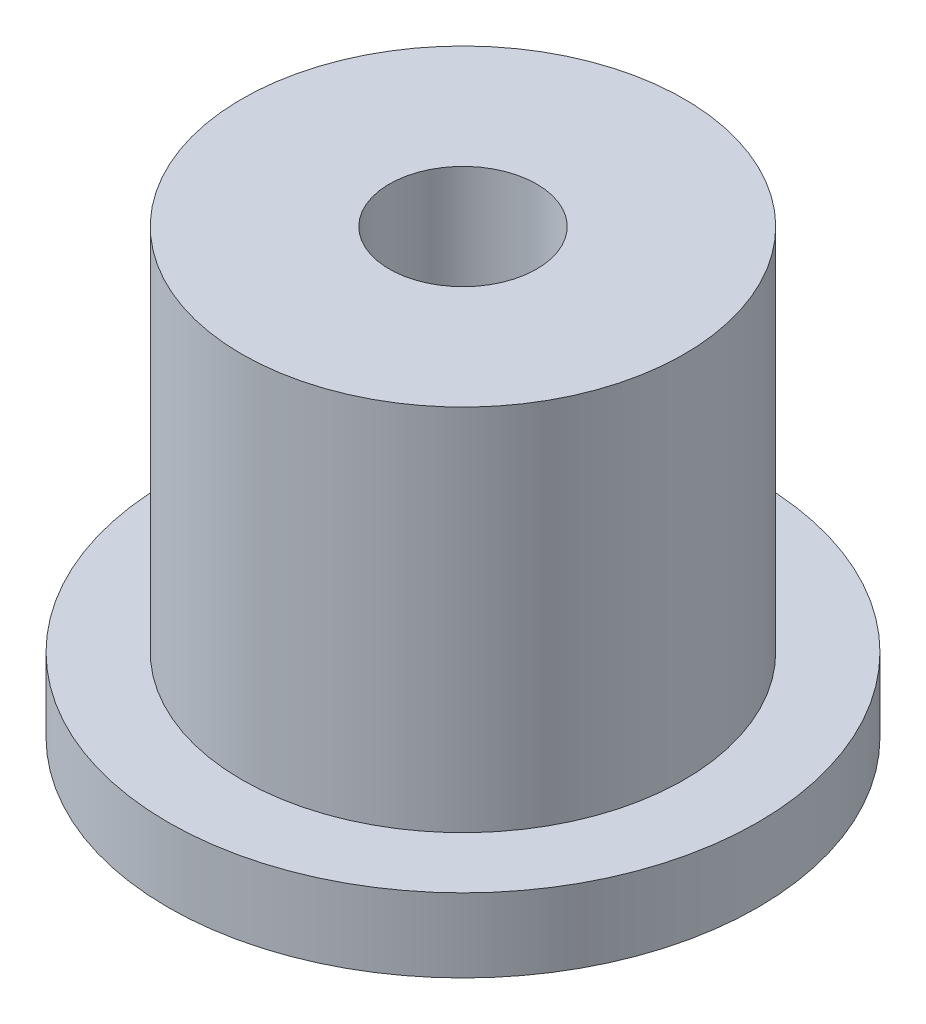
ISO-10303-21;
HEADER;
FILE_DESCRIPTION(('STEP AP214'),'2;1');
FILE_NAME('part.step','',(''),(''),'','','');
FILE_SCHEMA(('AUTOMOTIVE_DESIGN { 1 0 10303 214 1 1 1 1 }'));
ENDSEC;
DATA;
#1=APPLICATION_CONTEXT('core data for automotive mechanical design processes');
#2=APPLICATION_PROTOCOL_DEFINITION('international standard','automotive_design',2000,#1);
#3=PRODUCT_CONTEXT('',#1,'mechanical');
#4=PRODUCT('Part','Part','',(#3));
#5=PRODUCT_RELATED_PRODUCT_CATEGORY('part','',(#4));
#6=PRODUCT_DEFINITION_FORMATION('','',#4);
#7=PRODUCT_DEFINITION_CONTEXT('part definition',#1,'design');
#8=PRODUCT_DEFINITION('design','',#6,#7);
#9=PRODUCT_DEFINITION_SHAPE('','',#8);
#10=(LENGTH_UNIT() NAMED_UNIT(*) SI_UNIT(.MILLI.,.METRE.));
#11=(NAMED_UNIT(*) PLANE_ANGLE_UNIT() SI_UNIT($,.RADIAN.));
#12=(NAMED_UNIT(*) SI_UNIT($,.STERADIAN.) SOLID_ANGLE_UNIT());
#13=UNCERTAINTY_MEASURE_WITH_UNIT(LENGTH_MEASURE(1.E-05),#10,'distance_accuracy_value','');
#14=(GEOMETRIC_REPRESENTATION_CONTEXT(3) GLOBAL_UNCERTAINTY_ASSIGNED_CONTEXT((#13)) GLOBAL_UNIT_ASSIGNED_CONTEXT((#10,
#11,#12)) REPRESENTATION_CONTEXT('',''));
#15=CARTESIAN_POINT('',(0.,0.,0.));
#16=DIRECTION('',(0.,0.,1.));
#17=DIRECTION('',(1.,0.,0.));
#18=AXIS2_PLACEMENT_3D('',#15,#16,#17);
#19=CARTESIAN_POINT('',(0.,6.35,0.));
#20=DIRECTION('',(0.,-1.,0.));
#21=DIRECTION('',(0.,0.,-1.));
#22=AXIS2_PLACEMENT_3D('',#19,#20,#21);
#23=CYLINDRICAL_SURFACE('',#22,25.4);
#24=CARTESIAN_POINT('',(0.,6.35,0.));
#25=DIRECTION('',(0.,1.,0.));
#26=DIRECTION('',(0.,0.,1.));
#27=AXIS2_PLACEMENT_3D('',#24,#25,#26);
#28=CIRCLE('',#27,25.4);
#29=CARTESIAN_POINT('',(0.,6.35,25.4));
#30=VERTEX_POINT('',#29);
#31=EDGE_CURVE('E51',#30,#30,#28,.T.);
#32=ORIENTED_EDGE('',*,*,#31,.F.);
#33=EDGE_LOOP('',(#32));
#34=FACE_BOUND('',#33,.T.);
#35=CARTESIAN_POINT('',(0.,0.,0.));
#36=DIRECTION('',(0.,1.,0.));
#37=DIRECTION('',(0.,0.,1.));
#38=AXIS2_PLACEMENT_3D('',#35,#36,#37);
#39=CIRCLE('',#38,25.4);
#40=CARTESIAN_POINT('',(0.,0.,25.4));
#41=VERTEX_POINT('',#40);
#42=EDGE_CURVE('E46',#41,#41,#39,.T.);
#43=ORIENTED_EDGE('',*,*,#42,.T.);
#44=EDGE_LOOP('',(#43));
#45=FACE_BOUND('',#44,.T.);
#46=ADVANCED_FACE('F43',(#34,#45),#23,.T.);
#47=CARTESIAN_POINT('',(0.,6.35,0.));
#48=DIRECTION('',(0.,1.,0.));
#49=DIRECTION('',(0.,0.,1.));
#50=AXIS2_PLACEMENT_3D('',#47,#48,#49);
#51=PLANE('',#50);
#52=CARTESIAN_POINT('',(0.,6.35,0.));
#53=DIRECTION('',(0.,1.,0.));
#54=DIRECTION('',(0.,0.,1.));
#55=AXIS2_PLACEMENT_3D('',#52,#53,#54);
#56=CIRCLE('',#55,19.05);
#57=CARTESIAN_POINT('',(0.,6.35,19.05));
#58=VERTEX_POINT('',#57);
#59=EDGE_CURVE('E10',#58,#58,#56,.T.);
#60=ORIENTED_EDGE('',*,*,#59,.F.);
#61=EDGE_LOOP('',(#60));
#62=FACE_BOUND('',#61,.T.);
#63=ORIENTED_EDGE('',*,*,#31,.T.);
#64=EDGE_LOOP('',(#63));
#65=FACE_BOUND('',#64,.T.);
#66=ADVANCED_FACE('F86',(#62,#65),#51,.T.);
#67=CARTESIAN_POINT('',(0.,0.,0.));
#68=DIRECTION('',(0.,1.,0.));
#69=DIRECTION('',(0.,0.,1.));
#70=AXIS2_PLACEMENT_3D('',#67,#68,#69);
#71=PLANE('',#70);
#72=CARTESIAN_POINT('',(0.,0.,0.));
#73=DIRECTION('',(0.,-1.,0.));
#74=DIRECTION('',(0.,0.,-1.));
#75=AXIS2_PLACEMENT_3D('',#72,#73,#74);
#76=CIRCLE('',#75,6.35);
#77=CARTESIAN_POINT('',(0.,0.,-6.35));
#78=VERTEX_POINT('',#77);
#79=EDGE_CURVE('E64',#78,#78,#76,.T.);
#80=ORIENTED_EDGE('',*,*,#79,.F.);
#81=EDGE_LOOP('',(#80));
#82=FACE_BOUND('',#81,.T.);
#83=ORIENTED_EDGE('',*,*,#42,.F.);
#84=EDGE_LOOP('',(#83));
#85=FACE_BOUND('',#84,.T.);
#86=ADVANCED_FACE('F82',(#82,#85),#71,.F.);
#87=CARTESIAN_POINT('',(0.,38.1,0.));
#88=DIRECTION('',(0.,-1.,0.));
#89=DIRECTION('',(0.,0.,-1.));
#90=AXIS2_PLACEMENT_3D('',#87,#88,#89);
#91=CYLINDRICAL_SURFACE('',#90,19.05);
#92=CARTESIAN_POINT('',(0.,38.1,0.));
#93=DIRECTION('',(0.,1.,0.));
#94=DIRECTION('',(0.,0.,1.));
#95=AXIS2_PLACEMENT_3D('',#92,#93,#94);
#96=CIRCLE('',#95,19.05);
#97=CARTESIAN_POINT('',(0.,38.1,19.05));
#98=VERTEX_POINT('',#97);
#99=EDGE_CURVE('E59',#98,#98,#96,.T.);
#100=ORIENTED_EDGE('',*,*,#99,.F.);
#101=EDGE_LOOP('',(#100));
#102=FACE_BOUND('',#101,.T.);
#103=ORIENTED_EDGE('',*,*,#59,.T.);
#104=EDGE_LOOP('',(#103));
#105=FACE_BOUND('',#104,.T.);
#106=ADVANCED_FACE('F85',(#102,#105),#91,.T.);
#107=CARTESIAN_POINT('',(0.,38.1,0.));
#108=DIRECTION('',(0.,1.,0.));
#109=DIRECTION('',(0.,0.,1.));
#110=AXIS2_PLACEMENT_3D('',#107,#108,#109);
#111=PLANE('',#110);
#112=CARTESIAN_POINT('',(0.,38.1,0.));
#113=DIRECTION('',(0.,-1.,0.));
#114=DIRECTION('',(0.,0.,-1.));
#115=AXIS2_PLACEMENT_3D('',#112,#113,#114);
#116=CIRCLE('',#115,6.35);
#117=CARTESIAN_POINT('',(0.,38.1,-6.35));
#118=VERTEX_POINT('',#117);
#119=EDGE_CURVE('E63',#118,#118,#116,.T.);
#120=ORIENTED_EDGE('',*,*,#119,.T.);
#121=EDGE_LOOP('',(#120));
#122=FACE_BOUND('',#121,.T.);
#123=ORIENTED_EDGE('',*,*,#99,.T.);
#124=EDGE_LOOP('',(#123));
#125=FACE_BOUND('',#124,.T.);
#126=ADVANCED_FACE('F73',(#122,#125),#111,.T.);
#127=CARTESIAN_POINT('',(0.,38.1,0.));
#128=DIRECTION('',(0.,-1.,0.));
#129=DIRECTION('',(0.,0.,-1.));
#130=AXIS2_PLACEMENT_3D('',#127,#128,#129);
#131=CYLINDRICAL_SURFACE('',#130,6.35);
#132=CARTESIAN_POINT('',(0.,38.1,-6.35));
#133=CARTESIAN_POINT('',(0.,37.703125,-6.35));
#134=CARTESIAN_POINT('',(0.,37.30625,-6.35));
#135=CARTESIAN_POINT('',(0.,36.5125,-6.35));
#136=CARTESIAN_POINT('',(0.,36.115625,-6.35));
#137=CARTESIAN_POINT('',(0.,35.321875,-6.35));
#138=CARTESIAN_POINT('',(0.,34.925,-6.35));
#139=CARTESIAN_POINT('',(0.,34.13125,-6.35));
#140=CARTESIAN_POINT('',(0.,33.734375,-6.35));
#141=CARTESIAN_POINT('',(0.,32.940625,-6.35));
#142=CARTESIAN_POINT('',(0.,32.54375,-6.35));
#143=CARTESIAN_POINT('',(0.,31.75,-6.35));
#144=CARTESIAN_POINT('',(0.,31.353125,-6.35));
#145=CARTESIAN_POINT('',(0.,30.559375,-6.35));
#146=CARTESIAN_POINT('',(0.,30.1625,-6.35));
#147=CARTESIAN_POINT('',(0.,29.36875,-6.35));
#148=CARTESIAN_POINT('',(0.,28.971875,-6.35));
#149=CARTESIAN_POINT('',(0.,28.178125,-6.35));
#150=CARTESIAN_POINT('',(0.,27.78125,-6.35));
#151=CARTESIAN_POINT('',(0.,26.9875,-6.35));
#152=CARTESIAN_POINT('',(0.,26.590625,-6.35));
#153=CARTESIAN_POINT('',(0.,25.796875,-6.35));
#154=CARTESIAN_POINT('',(0.,25.4,-6.35));
#155=CARTESIAN_POINT('',(0.,24.60625,-6.35));
#156=CARTESIAN_POINT('',(0.,24.209375,-6.35));
#157=CARTESIAN_POINT('',(0.,23.415625,-6.35));
#158=CARTESIAN_POINT('',(0.,23.01875,-6.35));
#159=CARTESIAN_POINT('',(0.,22.225,-6.35));
#160=CARTESIAN_POINT('',(0.,21.828125,-6.35));
#161=CARTESIAN_POINT('',(0.,21.034375,-6.35));
#162=CARTESIAN_POINT('',(0.,20.6375,-6.35));
#163=CARTESIAN_POINT('',(0.,19.84375,-6.35));
#164=CARTESIAN_POINT('',(0.,19.446875,-6.35));
#165=CARTESIAN_POINT('',(0.,18.653125,-6.35));
#166=CARTESIAN_POINT('',(0.,18.25625,-6.35));
#167=CARTESIAN_POINT('',(0.,17.4625,-6.35));
#168=CARTESIAN_POINT('',(0.,17.065625,-6.35));
#169=CARTESIAN_POINT('',(0.,16.271875,-6.35));
#170=CARTESIAN_POINT('',(0.,15.875,-6.35));
#171=CARTESIAN_POINT('',(0.,15.08125,-6.35));
#172=CARTESIAN_POINT('',(0.,14.684375,-6.35));
#173=CARTESIAN_POINT('',(0.,13.890625,-6.35));
#174=CARTESIAN_POINT('',(0.,13.49375,-6.35));
#175=CARTESIAN_POINT('',(0.,12.7,-6.35));
#176=CARTESIAN_POINT('',(0.,12.303125,-6.35));
#177=CARTESIAN_POINT('',(0.,11.509375,-6.35));
#178=CARTESIAN_POINT('',(0.,11.1125,-6.35));
#179=CARTESIAN_POINT('',(0.,10.31875,-6.35));
#180=CARTESIAN_POINT('',(0.,9.921875,-6.35));
#181=CARTESIAN_POINT('',(0.,9.128125,-6.35));
#182=CARTESIAN_POINT('',(0.,8.73125,-6.35));
#183=CARTESIAN_POINT('',(0.,7.9375,-6.35));
#184=CARTESIAN_POINT('',(0.,7.540625,-6.35));
#185=CARTESIAN_POINT('',(0.,6.746875,-6.35));
#186=CARTESIAN_POINT('',(0.,6.35,-6.35));
#187=CARTESIAN_POINT('',(0.,5.55625,-6.35));
#188=CARTESIAN_POINT('',(0.,5.159375,-6.35));
#189=CARTESIAN_POINT('',(0.,4.365625,-6.35));
#190=CARTESIAN_POINT('',(0.,3.96875,-6.35));
#191=CARTESIAN_POINT('',(0.,3.175,-6.35));
#192=CARTESIAN_POINT('',(0.,2.778125,-6.35));
#193=CARTESIAN_POINT('',(0.,1.984375,-6.35));
#194=CARTESIAN_POINT('',(0.,1.5875,-6.35));
#195=CARTESIAN_POINT('',(0.,0.79375,-6.35));
#196=CARTESIAN_POINT('',(0.,0.396875,-6.35));
#197=CARTESIAN_POINT('',(0.,0.,-6.35));
#198=B_SPLINE_CURVE_WITH_KNOTS('',3,(#132,#133,#134,#135,#136,#137,#138,#139,#140,#141,#142,
#143,#144,#145,#146,#147,#148,#149,#150,#151,#152,#153,#154,#155,#156,#157,#158,#159,#160,#161,
#162,#163,#164,#165,#166,#167,#168,#169,#170,#171,#172,#173,#174,#175,#176,#177,#178,#179,#180,
#181,#182,#183,#184,#185,#186,#187,#188,#189,#190,#191,#192,#193,#194,#195,#196,#197),
.UNSPECIFIED.,.F.,.F.,(4,2,2,2,2,2,2,2,2,2,2,2,2,2,2,2,2,2,2,2,2,2,2,2,2,2,2,2,2,2,2,2,4),(0.,
1.190625,2.38125,3.571875,4.7625,5.953125,7.14375,8.334375,9.52500000000001,10.715625,11.90625,
13.096875,14.2875,15.478125,16.66875,17.859375,19.05,20.240625,21.43125,22.621875,23.8125,
25.003125,26.19375,27.384375,28.575,29.765625,30.95625,32.146875,33.3375,34.528125,35.71875,
36.909375,38.1),.UNSPECIFIED.);
#199=EDGE_CURVE('BSEAM76',#118,#78,#198,.T.);
#200=ORIENTED_EDGE('',*,*,#119,.F.);
#201=ORIENTED_EDGE('',*,*,#79,.T.);
#202=ORIENTED_EDGE('',*,*,#199,.T.);
#203=ORIENTED_EDGE('',*,*,#199,.F.);
#204=EDGE_LOOP('',(#200,#202,#201,#203));
#205=FACE_BOUND('',#204,.T.);
#206=ADVANCED_FACE('F76',(#205),#131,.F.);
#207=CLOSED_SHELL('',(#46,#66,#86,#106,#126,#206));
#208=MANIFOLD_SOLID_BREP('B2',#207);
#209=ADVANCED_BREP_SHAPE_REPRESENTATION('',(#18,#208),#14);
#210=SHAPE_DEFINITION_REPRESENTATION(#9,#209);
ENDSEC;
END-ISO-10303-21;
